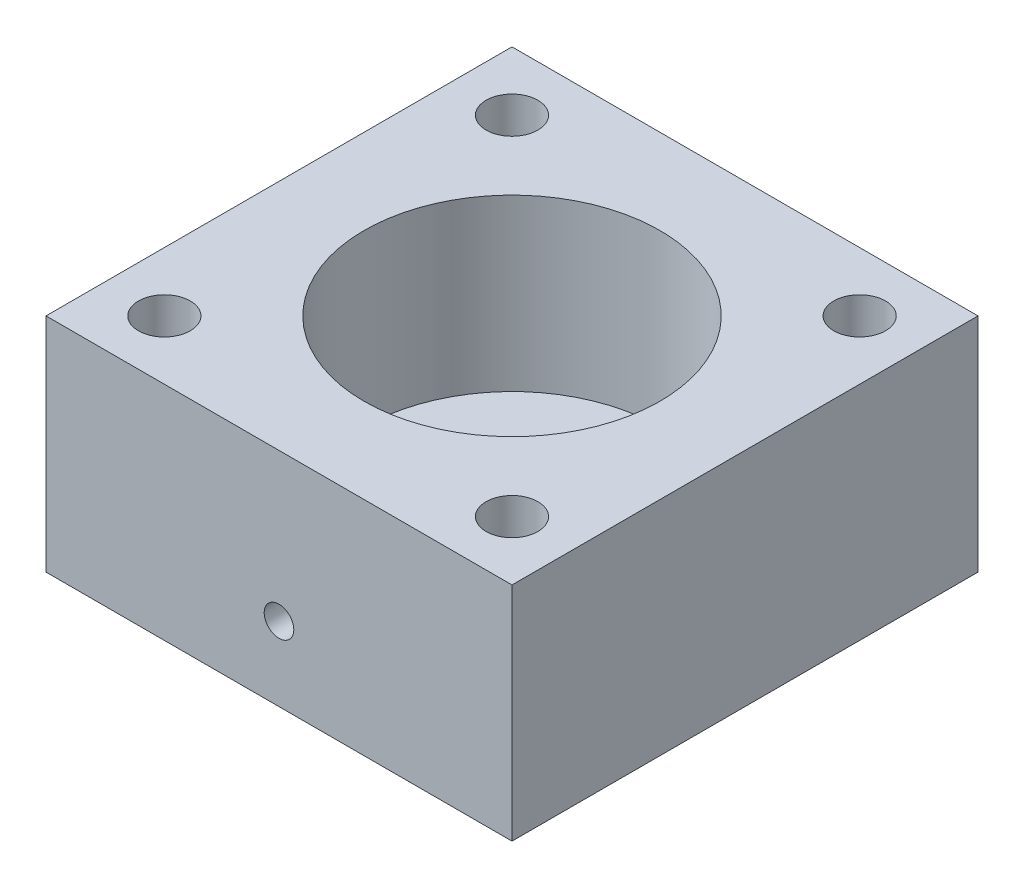
ISO-10303-21;
HEADER;
FILE_DESCRIPTION(('STEP AP214'),'2;1');
FILE_NAME('part.step','',(''),(''),'','','');
FILE_SCHEMA(('AUTOMOTIVE_DESIGN { 1 0 10303 214 1 1 1 1 }'));
ENDSEC;
DATA;
#1=APPLICATION_CONTEXT('core data for automotive mechanical design processes');
#2=APPLICATION_PROTOCOL_DEFINITION('international standard','automotive_design',2000,#1);
#3=PRODUCT_CONTEXT('',#1,'mechanical');
#4=PRODUCT('Part','Part','',(#3));
#5=PRODUCT_RELATED_PRODUCT_CATEGORY('part','',(#4));
#6=PRODUCT_DEFINITION_FORMATION('','',#4);
#7=PRODUCT_DEFINITION_CONTEXT('part definition',#1,'design');
#8=PRODUCT_DEFINITION('design','',#6,#7);
#9=PRODUCT_DEFINITION_SHAPE('','',#8);
#10=(LENGTH_UNIT() NAMED_UNIT(*) SI_UNIT(.MILLI.,.METRE.));
#11=(NAMED_UNIT(*) PLANE_ANGLE_UNIT() SI_UNIT($,.RADIAN.));
#12=(NAMED_UNIT(*) SI_UNIT($,.STERADIAN.) SOLID_ANGLE_UNIT());
#13=UNCERTAINTY_MEASURE_WITH_UNIT(LENGTH_MEASURE(1.E-05),#10,'distance_accuracy_value','');
#14=(GEOMETRIC_REPRESENTATION_CONTEXT(3) GLOBAL_UNCERTAINTY_ASSIGNED_CONTEXT((#13)) GLOBAL_UNIT_ASSIGNED_CONTEXT((#10,
#11,#12)) REPRESENTATION_CONTEXT('',''));
#15=CARTESIAN_POINT('',(0.,0.,0.));
#16=DIRECTION('',(0.,0.,1.));
#17=DIRECTION('',(1.,0.,0.));
#18=AXIS2_PLACEMENT_3D('',#15,#16,#17);
#19=CARTESIAN_POINT('',(-15.75,15.,15.75));
#20=DIRECTION('',(-1.,0.,0.));
#21=DIRECTION('',(0.,0.,1.));
#22=AXIS2_PLACEMENT_3D('',#19,#20,#21);
#23=PLANE('',#22);
#24=DIRECTION('',(0.,0.,-1.));
#25=VECTOR('',#24,1.);
#26=CARTESIAN_POINT('',(-15.75,0.,15.75));
#27=LINE('',#26,#25);
#28=CARTESIAN_POINT('',(-15.75,0.,15.75));
#29=VERTEX_POINT('',#28);
#30=CARTESIAN_POINT('',(-15.75,0.,-15.7499999999999));
#31=VERTEX_POINT('',#30);
#32=EDGE_CURVE('E99',#29,#31,#27,.T.);
#33=ORIENTED_EDGE('',*,*,#32,.F.);
#34=DIRECTION('',(0.,-1.,0.));
#35=VECTOR('',#34,1.);
#36=CARTESIAN_POINT('',(-15.75,15.,15.75));
#37=LINE('',#36,#35);
#38=CARTESIAN_POINT('',(-15.75,15.,15.75));
#39=VERTEX_POINT('',#38);
#40=EDGE_CURVE('E11',#39,#29,#37,.T.);
#41=ORIENTED_EDGE('',*,*,#40,.F.);
#42=DIRECTION('',(0.,0.,-1.));
#43=VECTOR('',#42,1.);
#44=CARTESIAN_POINT('',(-15.75,15.,15.75));
#45=LINE('',#44,#43);
#46=CARTESIAN_POINT('',(-15.75,15.,-15.7499999999999));
#47=VERTEX_POINT('',#46);
#48=EDGE_CURVE('E93',#39,#47,#45,.T.);
#49=ORIENTED_EDGE('',*,*,#48,.T.);
#50=DIRECTION('',(0.,-1.,0.));
#51=VECTOR('',#50,1.);
#52=CARTESIAN_POINT('',(-15.75,15.,-15.7499999999999));
#53=LINE('',#52,#51);
#54=EDGE_CURVE('E36',#47,#31,#53,.T.);
#55=ORIENTED_EDGE('',*,*,#54,.T.);
#56=EDGE_LOOP('',(#33,#41,#49,#55));
#57=FACE_BOUND('',#56,.T.);
#58=ADVANCED_FACE('F33',(#57),#23,.T.);
#59=CARTESIAN_POINT('',(-15.75,15.,15.75));
#60=DIRECTION('',(0.,0.,-1.));
#61=DIRECTION('',(-1.,0.,0.));
#62=AXIS2_PLACEMENT_3D('',#59,#60,#61);
#63=PLANE('',#62);
#64=CARTESIAN_POINT('',(0.,5.,15.75));
#65=DIRECTION('',(0.,0.,1.));
#66=DIRECTION('',(1.,0.,0.));
#67=AXIS2_PLACEMENT_3D('',#64,#65,#66);
#68=CIRCLE('',#67,1.);
#69=CARTESIAN_POINT('',(1.,5.,15.75));
#70=VERTEX_POINT('',#69);
#71=EDGE_CURVE('E173',#70,#70,#68,.T.);
#72=ORIENTED_EDGE('',*,*,#71,.F.);
#73=EDGE_LOOP('',(#72));
#74=FACE_BOUND('',#73,.T.);
#75=DIRECTION('',(1.,0.,0.));
#76=VECTOR('',#75,1.);
#77=CARTESIAN_POINT('',(-15.75,0.,15.75));
#78=LINE('',#77,#76);
#79=CARTESIAN_POINT('',(15.75,0.,15.75));
#80=VERTEX_POINT('',#79);
#81=EDGE_CURVE('E66',#29,#80,#78,.T.);
#82=ORIENTED_EDGE('',*,*,#81,.T.);
#83=DIRECTION('',(0.,-1.,0.));
#84=VECTOR('',#83,1.);
#85=CARTESIAN_POINT('',(15.75,15.,15.75));
#86=LINE('',#85,#84);
#87=CARTESIAN_POINT('',(15.75,15.,15.75));
#88=VERTEX_POINT('',#87);
#89=EDGE_CURVE('E42',#88,#80,#86,.T.);
#90=ORIENTED_EDGE('',*,*,#89,.F.);
#91=DIRECTION('',(1.,0.,0.));
#92=VECTOR('',#91,1.);
#93=CARTESIAN_POINT('',(-15.75,15.,15.75));
#94=LINE('',#93,#92);
#95=EDGE_CURVE('E83',#39,#88,#94,.T.);
#96=ORIENTED_EDGE('',*,*,#95,.F.);
#97=ORIENTED_EDGE('',*,*,#40,.T.);
#98=EDGE_LOOP('',(#82,#90,#96,#97));
#99=FACE_BOUND('',#98,.T.);
#100=ADVANCED_FACE('F110',(#74,#99),#63,.F.);
#101=CARTESIAN_POINT('',(15.75,15.,15.75));
#102=DIRECTION('',(-1.,0.,0.));
#103=DIRECTION('',(0.,0.,1.));
#104=AXIS2_PLACEMENT_3D('',#101,#102,#103);
#105=PLANE('',#104);
#106=DIRECTION('',(0.,0.,-1.));
#107=VECTOR('',#106,1.);
#108=CARTESIAN_POINT('',(15.75,0.,15.75));
#109=LINE('',#108,#107);
#110=CARTESIAN_POINT('',(15.75,0.,-15.7499999999999));
#111=VERTEX_POINT('',#110);
#112=EDGE_CURVE('E90',#80,#111,#109,.T.);
#113=ORIENTED_EDGE('',*,*,#112,.T.);
#114=DIRECTION('',(0.,-1.,0.));
#115=VECTOR('',#114,1.);
#116=CARTESIAN_POINT('',(15.75,15.,-15.7499999999999));
#117=LINE('',#116,#115);
#118=CARTESIAN_POINT('',(15.75,15.,-15.7499999999999));
#119=VERTEX_POINT('',#118);
#120=EDGE_CURVE('E87',#119,#111,#117,.T.);
#121=ORIENTED_EDGE('',*,*,#120,.F.);
#122=DIRECTION('',(0.,0.,-1.));
#123=VECTOR('',#122,1.);
#124=CARTESIAN_POINT('',(15.75,15.,15.75));
#125=LINE('',#124,#123);
#126=EDGE_CURVE('E78',#88,#119,#125,.T.);
#127=ORIENTED_EDGE('',*,*,#126,.F.);
#128=ORIENTED_EDGE('',*,*,#89,.T.);
#129=EDGE_LOOP('',(#113,#121,#127,#128));
#130=FACE_BOUND('',#129,.T.);
#131=ADVANCED_FACE('F88',(#130),#105,.F.);
#132=CARTESIAN_POINT('',(-15.75,15.,-15.7499999999999));
#133=DIRECTION('',(0.,0.,-1.));
#134=DIRECTION('',(-1.,0.,0.));
#135=AXIS2_PLACEMENT_3D('',#132,#133,#134);
#136=PLANE('',#135);
#137=DIRECTION('',(1.,0.,0.));
#138=VECTOR('',#137,1.);
#139=CARTESIAN_POINT('',(-15.75,0.,-15.7499999999999));
#140=LINE('',#139,#138);
#141=EDGE_CURVE('E102',#31,#111,#140,.T.);
#142=ORIENTED_EDGE('',*,*,#141,.F.);
#143=ORIENTED_EDGE('',*,*,#54,.F.);
#144=DIRECTION('',(1.,0.,0.));
#145=VECTOR('',#144,1.);
#146=CARTESIAN_POINT('',(-15.75,15.,-15.7499999999999));
#147=LINE('',#146,#145);
#148=EDGE_CURVE('E82',#47,#119,#147,.T.);
#149=ORIENTED_EDGE('',*,*,#148,.T.);
#150=ORIENTED_EDGE('',*,*,#120,.T.);
#151=EDGE_LOOP('',(#142,#143,#149,#150));
#152=FACE_BOUND('',#151,.T.);
#153=ADVANCED_FACE('F92',(#152),#136,.T.);
#154=CARTESIAN_POINT('',(0.,15.,0.));
#155=DIRECTION('',(0.,-1.,0.));
#156=DIRECTION('',(0.,0.,-1.));
#157=AXIS2_PLACEMENT_3D('',#154,#155,#156);
#158=PLANE('',#157);
#159=CARTESIAN_POINT('',(-11.75,15.,-11.7499999999999));
#160=DIRECTION('',(0.,1.,0.));
#161=DIRECTION('',(0.,0.,-1.));
#162=AXIS2_PLACEMENT_3D('',#159,#160,#161);
#163=CIRCLE('',#162,1.75);
#164=CARTESIAN_POINT('',(-11.75,15.,-13.4999999999999));
#165=VERTEX_POINT('',#164);
#166=EDGE_CURVE('E172',#165,#165,#163,.T.);
#167=ORIENTED_EDGE('',*,*,#166,.F.);
#168=EDGE_LOOP('',(#167));
#169=FACE_BOUND('',#168,.T.);
#170=CARTESIAN_POINT('',(11.75,15.,-11.7499999999999));
#171=DIRECTION('',(0.,1.,0.));
#172=DIRECTION('',(0.,0.,1.));
#173=AXIS2_PLACEMENT_3D('',#170,#171,#172);
#174=CIRCLE('',#173,1.75);
#175=CARTESIAN_POINT('',(11.75,15.,-9.99999999999993));
#176=VERTEX_POINT('',#175);
#177=EDGE_CURVE('E184',#176,#176,#174,.T.);
#178=ORIENTED_EDGE('',*,*,#177,.F.);
#179=EDGE_LOOP('',(#178));
#180=FACE_BOUND('',#179,.T.);
#181=CARTESIAN_POINT('',(11.75,15.,11.75));
#182=DIRECTION('',(0.,1.,0.));
#183=DIRECTION('',(0.,0.,-1.));
#184=AXIS2_PLACEMENT_3D('',#181,#182,#183);
#185=CIRCLE('',#184,1.75);
#186=CARTESIAN_POINT('',(11.75,15.,10.));
#187=VERTEX_POINT('',#186);
#188=EDGE_CURVE('E178',#187,#187,#185,.T.);
#189=ORIENTED_EDGE('',*,*,#188,.F.);
#190=EDGE_LOOP('',(#189));
#191=FACE_BOUND('',#190,.T.);
#192=CARTESIAN_POINT('',(-11.75,15.,11.75));
#193=DIRECTION('',(0.,1.,0.));
#194=DIRECTION('',(0.,0.,1.));
#195=AXIS2_PLACEMENT_3D('',#192,#193,#194);
#196=CIRCLE('',#195,1.75);
#197=CARTESIAN_POINT('',(-11.75,15.,13.5));
#198=VERTEX_POINT('',#197);
#199=EDGE_CURVE('E177',#198,#198,#196,.T.);
#200=ORIENTED_EDGE('',*,*,#199,.F.);
#201=EDGE_LOOP('',(#200));
#202=FACE_BOUND('',#201,.T.);
#203=CARTESIAN_POINT('',(0.,15.,0.));
#204=DIRECTION('',(0.,1.,0.));
#205=DIRECTION('',(0.,0.,1.));
#206=AXIS2_PLACEMENT_3D('',#203,#204,#205);
#207=CIRCLE('',#206,10.);
#208=CARTESIAN_POINT('',(0.,15.,10.));
#209=VERTEX_POINT('',#208);
#210=EDGE_CURVE('E195',#209,#209,#207,.T.);
#211=ORIENTED_EDGE('',*,*,#210,.F.);
#212=EDGE_LOOP('',(#211));
#213=FACE_BOUND('',#212,.T.);
#214=ORIENTED_EDGE('',*,*,#48,.F.);
#215=ORIENTED_EDGE('',*,*,#95,.T.);
#216=ORIENTED_EDGE('',*,*,#126,.T.);
#217=ORIENTED_EDGE('',*,*,#148,.F.);
#218=EDGE_LOOP('',(#214,#215,#216,#217));
#219=FACE_BOUND('',#218,.T.);
#220=ADVANCED_FACE('F81',(#169,#180,#191,#202,#213,#219),#158,.F.);
#221=CARTESIAN_POINT('',(0.,0.,0.));
#222=DIRECTION('',(0.,-1.,0.));
#223=DIRECTION('',(0.,0.,-1.));
#224=AXIS2_PLACEMENT_3D('',#221,#222,#223);
#225=PLANE('',#224);
#226=CARTESIAN_POINT('',(-11.75,0.,-11.7499999999999));
#227=DIRECTION('',(0.,1.,0.));
#228=DIRECTION('',(0.,0.,-1.));
#229=AXIS2_PLACEMENT_3D('',#226,#227,#228);
#230=CIRCLE('',#229,1.75);
#231=CARTESIAN_POINT('',(-11.75,0.,-13.4999999999999));
#232=VERTEX_POINT('',#231);
#233=EDGE_CURVE('E187',#232,#232,#230,.T.);
#234=ORIENTED_EDGE('',*,*,#233,.T.);
#235=EDGE_LOOP('',(#234));
#236=FACE_BOUND('',#235,.T.);
#237=CARTESIAN_POINT('',(11.75,0.,-11.7499999999999));
#238=DIRECTION('',(0.,1.,0.));
#239=DIRECTION('',(0.,0.,1.));
#240=AXIS2_PLACEMENT_3D('',#237,#238,#239);
#241=CIRCLE('',#240,1.75);
#242=CARTESIAN_POINT('',(11.75,0.,-9.99999999999993));
#243=VERTEX_POINT('',#242);
#244=EDGE_CURVE('E181',#243,#243,#241,.T.);
#245=ORIENTED_EDGE('',*,*,#244,.T.);
#246=EDGE_LOOP('',(#245));
#247=FACE_BOUND('',#246,.T.);
#248=CARTESIAN_POINT('',(11.75,0.,11.75));
#249=DIRECTION('',(0.,1.,0.));
#250=DIRECTION('',(0.,0.,-1.));
#251=AXIS2_PLACEMENT_3D('',#248,#249,#250);
#252=CIRCLE('',#251,1.75);
#253=CARTESIAN_POINT('',(11.75,0.,10.));
#254=VERTEX_POINT('',#253);
#255=EDGE_CURVE('E174',#254,#254,#252,.T.);
#256=ORIENTED_EDGE('',*,*,#255,.T.);
#257=EDGE_LOOP('',(#256));
#258=FACE_BOUND('',#257,.T.);
#259=CARTESIAN_POINT('',(-11.75,0.,11.75));
#260=DIRECTION('',(0.,1.,0.));
#261=DIRECTION('',(0.,0.,1.));
#262=AXIS2_PLACEMENT_3D('',#259,#260,#261);
#263=CIRCLE('',#262,1.75);
#264=CARTESIAN_POINT('',(-11.75,0.,13.5));
#265=VERTEX_POINT('',#264);
#266=EDGE_CURVE('E192',#265,#265,#263,.T.);
#267=ORIENTED_EDGE('',*,*,#266,.T.);
#268=EDGE_LOOP('',(#267));
#269=FACE_BOUND('',#268,.T.);
#270=ORIENTED_EDGE('',*,*,#32,.T.);
#271=ORIENTED_EDGE('',*,*,#141,.T.);
#272=ORIENTED_EDGE('',*,*,#112,.F.);
#273=ORIENTED_EDGE('',*,*,#81,.F.);
#274=EDGE_LOOP('',(#270,#271,#272,#273));
#275=FACE_BOUND('',#274,.T.);
#276=ADVANCED_FACE('F108',(#236,#247,#258,#269,#275),#225,.T.);
#277=CARTESIAN_POINT('',(0.,3.5,0.));
#278=DIRECTION('',(0.,1.,0.));
#279=DIRECTION('',(0.,0.,1.));
#280=AXIS2_PLACEMENT_3D('',#277,#278,#279);
#281=CYLINDRICAL_SURFACE('',#280,10.);
#282=CARTESIAN_POINT('',(1.,5.,9.9498743710662));
#283=CARTESIAN_POINT('',(0.999997573393512,4.9439804358264,9.94987502796903));
#284=CARTESIAN_POINT('',(0.995276858982475,4.88792383158816,9.95035256994218));
#285=CARTESIAN_POINT('',(0.976516314763562,4.77736481370647,9.95221087558119));
#286=CARTESIAN_POINT('',(0.962466214886435,4.72286418196251,9.95359263461219));
#287=CARTESIAN_POINT('',(0.925460116068926,4.61703418078209,9.95710133047387));
#288=CARTESIAN_POINT('',(0.902509516293899,4.56570291060856,9.9592278154679));
#289=CARTESIAN_POINT('',(0.848364267391101,4.46763220770825,9.9639858057182));
#290=CARTESIAN_POINT('',(0.817171255625926,4.42089186551628,9.96661721064329));
#291=CARTESIAN_POINT('',(0.747304761998704,4.3331487363425,9.97209926709899));
#292=CARTESIAN_POINT('',(0.708607418108259,4.29216499049622,9.97495060005266));
#293=CARTESIAN_POINT('',(0.624881715319564,4.21726239099643,9.98054505235719));
#294=CARTESIAN_POINT('',(0.579853066906569,4.18334386059369,9.98328816675213));
#295=CARTESIAN_POINT('',(0.484626361650988,4.12346874299285,9.98836383155605));
#296=CARTESIAN_POINT('',(0.434417662529569,4.09752900120634,9.99069550894647));
#297=CARTESIAN_POINT('',(0.33032998428751,4.05445556685132,9.99467816875771));
#298=CARTESIAN_POINT('',(0.276451094668219,4.03732165963053,9.99632916777064));
#299=CARTESIAN_POINT('',(0.16674478274295,4.01240209064675,9.99875966571026));
#300=CARTESIAN_POINT('',(0.110924527031581,4.00458516725005,9.99954207842817));
#301=CARTESIAN_POINT('',(-0.00124074068894321,3.99842473086628,10.0001571559869));
#302=CARTESIAN_POINT('',(-0.0575857390544615,4.00008097225373,9.99998984545273));
#303=CARTESIAN_POINT('',(-0.16898884406456,4.01279447265016,9.99872671311186));
#304=CARTESIAN_POINT('',(-0.224050829934979,4.02381811556389,9.99763421151713));
#305=CARTESIAN_POINT('',(-0.331539179504533,4.05490112894662,9.9946472926493));
#306=CARTESIAN_POINT('',(-0.383965508957729,4.07496061678757,9.99275286495953));
#307=CARTESIAN_POINT('',(-0.484800314679586,4.12358276325444,9.98836937483915));
#308=CARTESIAN_POINT('',(-0.53320157098165,4.15216029753016,9.98587927365758));
#309=CARTESIAN_POINT('',(-0.624533513174194,4.21699652333637,9.98058384519407));
#310=CARTESIAN_POINT('',(-0.667464038560828,4.25325544014518,9.97777850866811));
#311=CARTESIAN_POINT('',(-0.746832771822689,4.33261422951365,9.97215293467852));
#312=CARTESIAN_POINT('',(-0.783241746190344,4.37574334474158,9.96933268573028));
#313=CARTESIAN_POINT('',(-0.848307535357917,4.46751686521078,9.96400739928222));
#314=CARTESIAN_POINT('',(-0.876964338912889,4.51616127845214,9.96150236223964));
#315=CARTESIAN_POINT('',(-0.92571218457323,4.61760702519979,9.95709089514149));
#316=CARTESIAN_POINT('',(-0.94580142057296,4.67040923242289,9.95518459132555));
#317=CARTESIAN_POINT('',(-0.976820735637589,4.77866060461469,9.95218901870938));
#318=CARTESIAN_POINT('',(-0.987751093743033,4.83410968888744,9.95109972501768));
#319=CARTESIAN_POINT('',(-1.00010477539196,4.94582417952951,9.94986580527417));
#320=CARTESIAN_POINT('',(-1.00156899664721,5.00208502026483,9.94971711547603));
#321=CARTESIAN_POINT('',(-0.995056246871362,5.11405126582286,9.95037051354771));
#322=CARTESIAN_POINT('',(-0.987079403409754,5.16975667814037,9.95117258857061));
#323=CARTESIAN_POINT('',(-0.961945174507519,5.27891158227834,9.95363344422402));
#324=CARTESIAN_POINT('',(-0.944807127188908,5.33236557109466,9.95529042001345));
#325=CARTESIAN_POINT('',(-0.901856719675939,5.43564005173031,9.95927291038795));
#326=CARTESIAN_POINT('',(-0.876044160783587,5.48546046028718,9.9615984402867));
#327=CARTESIAN_POINT('',(-0.816375001423217,5.58023997402878,9.96666584355714));
#328=CARTESIAN_POINT('',(-0.782491299840691,5.62518194196625,9.96940910814672));
#329=CARTESIAN_POINT('',(-0.707680533451174,5.70875505327407,9.97499832625186));
#330=CARTESIAN_POINT('',(-0.666753294248134,5.74738604034008,9.97784428230866));
#331=CARTESIAN_POINT('',(-0.578839804226473,5.81738163339809,9.98333047849302));
#332=CARTESIAN_POINT('',(-0.531832255969451,5.84871955958622,9.98596994055474));
#333=CARTESIAN_POINT('',(-0.433197717417131,5.90305586850641,9.99073442106631));
#334=CARTESIAN_POINT('',(-0.381570790429625,5.9260543655071,9.99285944656492));
#335=CARTESIAN_POINT('',(-0.275256126432815,5.96301376765534,9.99635210414006));
#336=CARTESIAN_POINT('',(-0.22057403764996,5.97699078732521,9.99772108605649));
#337=CARTESIAN_POINT('',(-0.109624813983679,5.99556306957984,9.99955294613649));
#338=CARTESIAN_POINT('',(-0.0533577236922177,6.00015859583404,10.0000158497656));
#339=CARTESIAN_POINT('',(0.0589022240757466,5.99983373356006,9.99998338313269));
#340=CARTESIAN_POINT('',(0.114895207224528,5.99495476316334,9.99949218376669));
#341=CARTESIAN_POINT('',(0.225261888356363,5.97590625434302,9.99761493577591));
#342=CARTESIAN_POINT('',(0.279635585068366,5.96173670862703,9.99622888644873));
#343=CARTESIAN_POINT('',(0.385219908767743,5.92452074260707,9.99271723813962));
#344=CARTESIAN_POINT('',(0.436430966077528,5.90147553306584,9.99059174003249));
#345=CARTESIAN_POINT('',(0.534264600154795,5.84716683108302,9.98583812416296));
#346=CARTESIAN_POINT('',(0.580887203768558,5.81590338672888,9.98321000934154));
#347=CARTESIAN_POINT('',(0.668432724426938,5.74589038097625,9.97773184669055));
#348=CARTESIAN_POINT('',(0.70933092621934,5.7071099837552,9.97488091460699));
#349=CARTESIAN_POINT('',(0.784057759393142,5.62322464845455,9.96928590769659));
#350=CARTESIAN_POINT('',(0.817884691847847,5.57811819483092,9.96654185867777));
#351=CARTESIAN_POINT('',(0.877576640424053,5.48273565808009,9.96146383410601));
#352=CARTESIAN_POINT('',(0.903421187994834,5.43244671867595,9.95913091925306));
#353=CARTESIAN_POINT('',(0.946264708098768,5.32825170875377,9.95515194762462));
#354=CARTESIAN_POINT('',(0.963273657889857,5.27434979607429,9.95350511653359));
#355=CARTESIAN_POINT('',(0.983721688333529,5.18345225910088,9.95150007538145));
#356=CARTESIAN_POINT('',(0.989817712398225,5.14703774869357,9.95089331935694));
#357=CARTESIAN_POINT('',(0.997957658605114,5.07375417695745,9.95008025177663));
#358=CARTESIAN_POINT('',(1.00000159775726,5.03688511753741,9.94987393853984));
#359=CARTESIAN_POINT('',(1.,5.,9.9498743710662));
#360=B_SPLINE_CURVE_WITH_KNOTS('',3,(#282,#283,#284,#285,#286,#287,#288,#289,#290,#291,#292,
#293,#294,#295,#296,#297,#298,#299,#300,#301,#302,#303,#304,#305,#306,#307,#308,#309,#310,#311,
#312,#313,#314,#315,#316,#317,#318,#319,#320,#321,#322,#323,#324,#325,#326,#327,#328,#329,#330,
#331,#332,#333,#334,#335,#336,#337,#338,#339,#340,#341,#342,#343,#344,#345,#346,#347,#348,#349,
#350,#351,#352,#353,#354,#355,#356,#357,#358,#359),.UNSPECIFIED.,.T.,.F.,(4,2,2,2,2,2,2,2,2,2,2,
2,2,2,2,2,2,2,2,2,2,2,2,2,2,2,2,2,2,2,2,2,2,2,2,2,2,2,4),(0.,0.167923994436462,
0.336033151821769,0.504040490997473,0.672014480421314,0.84053161529925,1.00905645855253,
1.17793469971292,1.34680882407795,1.5151147089845,1.68341622998232,1.85111631818662,
2.01881858480974,2.18681545466413,2.35481725218529,2.52355425085001,2.69229149427563,
2.86106429117934,3.02983194595033,3.19786996307765,3.3659057096687,3.53358814704527,
3.70127442561047,3.86953189811718,4.03779353723203,4.20666136818118,4.37552688518005,
4.54408992694361,4.71264823113149,4.88047133468483,5.04829456996658,5.21609491995246,
5.38389428810799,5.55239715037988,5.72094045034525,5.88991241070476,6.05869314894001,
6.16926027606046,6.27982693903815),.UNSPECIFIED.);
#361=CARTESIAN_POINT('',(1.,5.,9.9498743710662));
#362=VERTEX_POINT('',#361);
#363=EDGE_CURVE('E166',#362,#362,#360,.T.);
#364=ORIENTED_EDGE('',*,*,#363,.F.);
#365=EDGE_LOOP('',(#364));
#366=FACE_BOUND('',#365,.T.);
#367=CARTESIAN_POINT('',(0.,3.5,0.));
#368=DIRECTION('',(0.,1.,0.));
#369=DIRECTION('',(0.,0.,1.));
#370=AXIS2_PLACEMENT_3D('',#367,#368,#369);
#371=CIRCLE('',#370,10.);
#372=CARTESIAN_POINT('',(0.,3.5,10.));
#373=VERTEX_POINT('',#372);
#374=EDGE_CURVE('E103',#373,#373,#371,.T.);
#375=ORIENTED_EDGE('',*,*,#374,.F.);
#376=EDGE_LOOP('',(#375));
#377=FACE_BOUND('',#376,.T.);
#378=ORIENTED_EDGE('',*,*,#210,.T.);
#379=EDGE_LOOP('',(#378));
#380=FACE_BOUND('',#379,.T.);
#381=ADVANCED_FACE('F131',(#366,#377,#380),#281,.F.);
#382=CARTESIAN_POINT('',(0.,3.5,0.));
#383=DIRECTION('',(0.,1.,0.));
#384=DIRECTION('',(0.,0.,1.));
#385=AXIS2_PLACEMENT_3D('',#382,#383,#384);
#386=PLANE('',#385);
#387=ORIENTED_EDGE('',*,*,#374,.T.);
#388=EDGE_LOOP('',(#387));
#389=FACE_BOUND('',#388,.T.);
#390=ADVANCED_FACE('F138',(#389),#386,.T.);
#391=CARTESIAN_POINT('',(-11.75,0.,11.75));
#392=DIRECTION('',(0.,1.,0.));
#393=DIRECTION('',(0.,0.,1.));
#394=AXIS2_PLACEMENT_3D('',#391,#392,#393);
#395=CYLINDRICAL_SURFACE('',#394,1.75);
#396=ORIENTED_EDGE('',*,*,#266,.F.);
#397=EDGE_LOOP('',(#396));
#398=FACE_BOUND('',#397,.T.);
#399=ORIENTED_EDGE('',*,*,#199,.T.);
#400=EDGE_LOOP('',(#399));
#401=FACE_BOUND('',#400,.T.);
#402=ADVANCED_FACE('F142',(#398,#401),#395,.F.);
#403=CARTESIAN_POINT('',(11.75,0.,11.75));
#404=DIRECTION('',(0.,1.,0.));
#405=DIRECTION('',(0.,0.,1.));
#406=AXIS2_PLACEMENT_3D('',#403,#404,#405);
#407=CYLINDRICAL_SURFACE('',#406,1.75);
#408=ORIENTED_EDGE('',*,*,#255,.F.);
#409=EDGE_LOOP('',(#408));
#410=FACE_BOUND('',#409,.T.);
#411=ORIENTED_EDGE('',*,*,#188,.T.);
#412=EDGE_LOOP('',(#411));
#413=FACE_BOUND('',#412,.T.);
#414=ADVANCED_FACE('F146',(#410,#413),#407,.F.);
#415=CARTESIAN_POINT('',(11.75,0.,-11.7499999999999));
#416=DIRECTION('',(0.,1.,0.));
#417=DIRECTION('',(0.,0.,1.));
#418=AXIS2_PLACEMENT_3D('',#415,#416,#417);
#419=CYLINDRICAL_SURFACE('',#418,1.75);
#420=ORIENTED_EDGE('',*,*,#244,.F.);
#421=EDGE_LOOP('',(#420));
#422=FACE_BOUND('',#421,.T.);
#423=ORIENTED_EDGE('',*,*,#177,.T.);
#424=EDGE_LOOP('',(#423));
#425=FACE_BOUND('',#424,.T.);
#426=ADVANCED_FACE('F152',(#422,#425),#419,.F.);
#427=CARTESIAN_POINT('',(-11.75,0.,-11.7499999999999));
#428=DIRECTION('',(0.,1.,0.));
#429=DIRECTION('',(0.,0.,1.));
#430=AXIS2_PLACEMENT_3D('',#427,#428,#429);
#431=CYLINDRICAL_SURFACE('',#430,1.75);
#432=ORIENTED_EDGE('',*,*,#233,.F.);
#433=EDGE_LOOP('',(#432));
#434=FACE_BOUND('',#433,.T.);
#435=ORIENTED_EDGE('',*,*,#166,.T.);
#436=EDGE_LOOP('',(#435));
#437=FACE_BOUND('',#436,.T.);
#438=ADVANCED_FACE('F148',(#434,#437),#431,.F.);
#439=CARTESIAN_POINT('',(0.,5.,-15.7509999999999));
#440=DIRECTION('',(0.,0.,1.));
#441=DIRECTION('',(1.,0.,0.));
#442=AXIS2_PLACEMENT_3D('',#439,#440,#441);
#443=CYLINDRICAL_SURFACE('',#442,1.);
#444=ORIENTED_EDGE('',*,*,#363,.T.);
#445=EDGE_LOOP('',(#444));
#446=FACE_BOUND('',#445,.T.);
#447=ORIENTED_EDGE('',*,*,#71,.T.);
#448=EDGE_LOOP('',(#447));
#449=FACE_BOUND('',#448,.T.);
#450=ADVANCED_FACE('F151',(#446,#449),#443,.F.);
#451=CLOSED_SHELL('',(#58,#100,#131,#153,#220,#276,#381,#390,#402,#414,#426,#438,#450));
#452=MANIFOLD_SOLID_BREP('B2',#451);
#453=ADVANCED_BREP_SHAPE_REPRESENTATION('',(#18,#452),#14);
#454=SHAPE_DEFINITION_REPRESENTATION(#9,#453);
ENDSEC;
END-ISO-10303-21;
